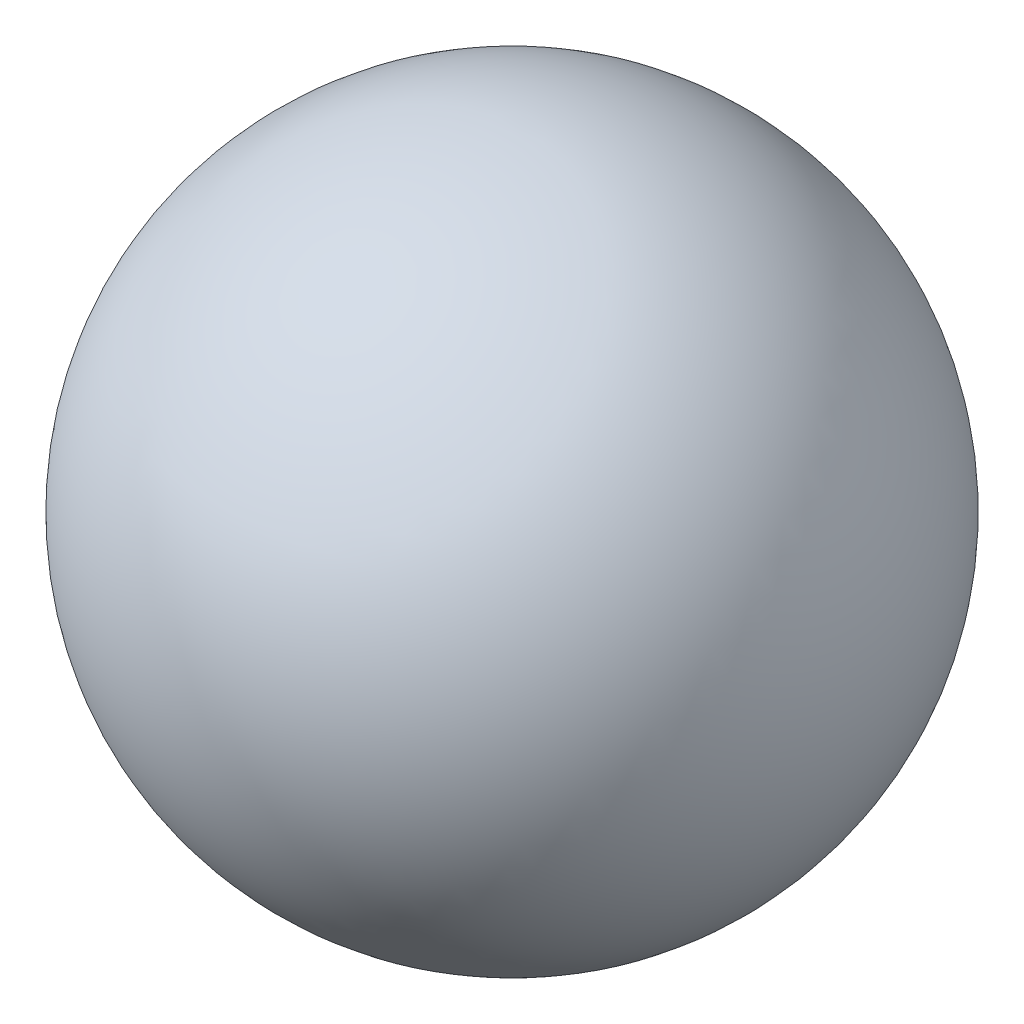
ISO-10303-21;
HEADER;
FILE_DESCRIPTION(('STEP AP214'),'2;1');
FILE_NAME('part.step','',(''),(''),'','','');
FILE_SCHEMA(('AUTOMOTIVE_DESIGN { 1 0 10303 214 1 1 1 1 }'));
ENDSEC;
DATA;
#1=APPLICATION_CONTEXT('core data for automotive mechanical design processes');
#2=APPLICATION_PROTOCOL_DEFINITION('international standard','automotive_design',2000,#1);
#3=PRODUCT_CONTEXT('',#1,'mechanical');
#4=PRODUCT('Part','Part','',(#3));
#5=PRODUCT_RELATED_PRODUCT_CATEGORY('part','',(#4));
#6=PRODUCT_DEFINITION_FORMATION('','',#4);
#7=PRODUCT_DEFINITION_CONTEXT('part definition',#1,'design');
#8=PRODUCT_DEFINITION('design','',#6,#7);
#9=PRODUCT_DEFINITION_SHAPE('','',#8);
#10=(LENGTH_UNIT() NAMED_UNIT(*) SI_UNIT(.MILLI.,.METRE.));
#11=(NAMED_UNIT(*) PLANE_ANGLE_UNIT() SI_UNIT($,.RADIAN.));
#12=(NAMED_UNIT(*) SI_UNIT($,.STERADIAN.) SOLID_ANGLE_UNIT());
#13=UNCERTAINTY_MEASURE_WITH_UNIT(LENGTH_MEASURE(1.E-05),#10,'distance_accuracy_value','');
#14=(GEOMETRIC_REPRESENTATION_CONTEXT(3) GLOBAL_UNCERTAINTY_ASSIGNED_CONTEXT((#13)) GLOBAL_UNIT_ASSIGNED_CONTEXT((#10,
#11,#12)) REPRESENTATION_CONTEXT('',''));
#15=CARTESIAN_POINT('',(0.,0.,0.));
#16=DIRECTION('',(0.,0.,1.));
#17=DIRECTION('',(1.,0.,0.));
#18=AXIS2_PLACEMENT_3D('',#15,#16,#17);
#19=CARTESIAN_POINT('',(0.,0.,0.));
#20=DIRECTION('',(0.,1.,0.));
#21=DIRECTION('',(1.,0.,0.));
#22=AXIS2_PLACEMENT_3D('',#19,#20,#21);
#23=SPHERICAL_SURFACE('',#22,155.575);
#24=CARTESIAN_POINT('',(0.,155.575,0.));
#25=VERTEX_POINT('',#24);
#26=VERTEX_LOOP('',#25);
#27=FACE_BOUND('',#26,.T.);
#28=ADVANCED_FACE('F29',(#27),#23,.T.);
#29=CLOSED_SHELL('',(#28));
#30=MANIFOLD_SOLID_BREP('B2',#29);
#31=ADVANCED_BREP_SHAPE_REPRESENTATION('',(#18,#30),#14);
#32=SHAPE_DEFINITION_REPRESENTATION(#9,#31);
ENDSEC;
END-ISO-10303-21;
